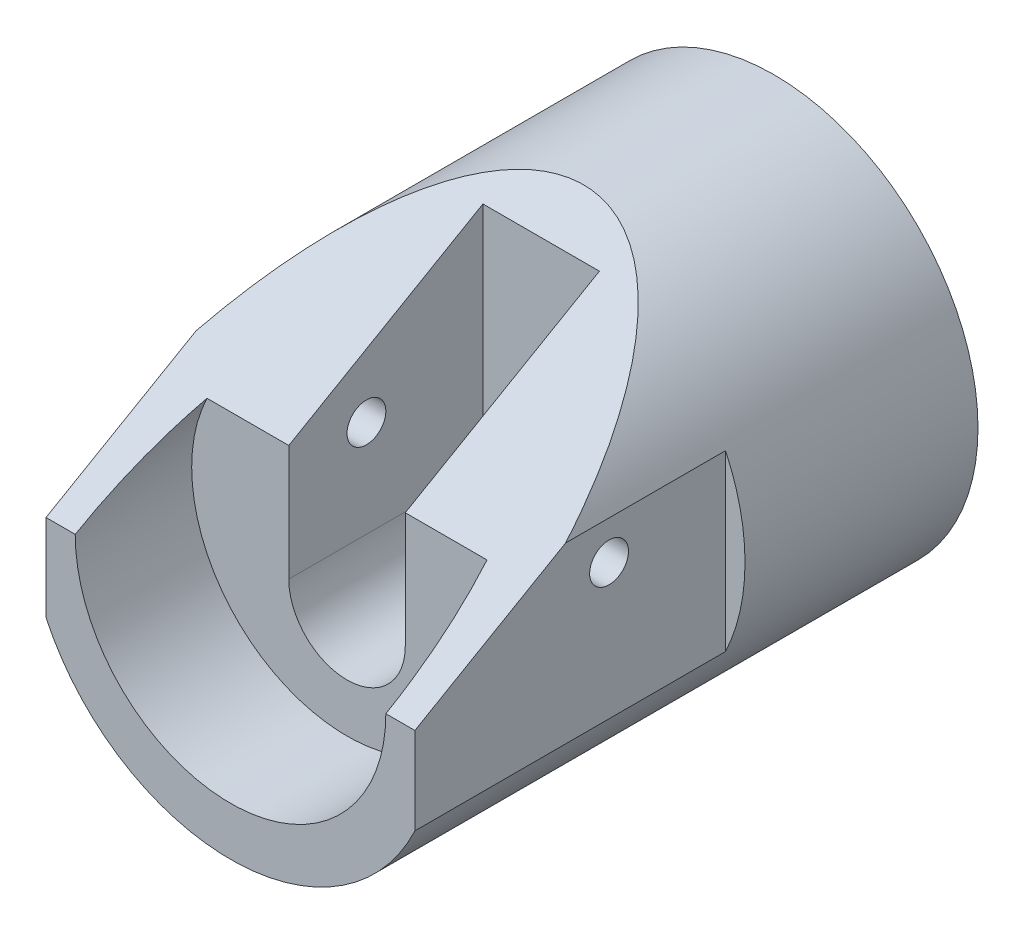
ISO-10303-21;
HEADER;
FILE_DESCRIPTION(('STEP AP214'),'2;1');
FILE_NAME('part.step','',(''),(''),'','','');
FILE_SCHEMA(('AUTOMOTIVE_DESIGN { 1 0 10303 214 1 1 1 1 }'));
ENDSEC;
DATA;
#1=APPLICATION_CONTEXT('core data for automotive mechanical design processes');
#2=APPLICATION_PROTOCOL_DEFINITION('international standard','automotive_design',2000,#1);
#3=PRODUCT_CONTEXT('',#1,'mechanical');
#4=PRODUCT('Part','Part','',(#3));
#5=PRODUCT_RELATED_PRODUCT_CATEGORY('part','',(#4));
#6=PRODUCT_DEFINITION_FORMATION('','',#4);
#7=PRODUCT_DEFINITION_CONTEXT('part definition',#1,'design');
#8=PRODUCT_DEFINITION('design','',#6,#7);
#9=PRODUCT_DEFINITION_SHAPE('','',#8);
#10=(LENGTH_UNIT() NAMED_UNIT(*) SI_UNIT(.MILLI.,.METRE.));
#11=(NAMED_UNIT(*) PLANE_ANGLE_UNIT() SI_UNIT($,.RADIAN.));
#12=(NAMED_UNIT(*) SI_UNIT($,.STERADIAN.) SOLID_ANGLE_UNIT());
#13=UNCERTAINTY_MEASURE_WITH_UNIT(LENGTH_MEASURE(1.E-05),#10,'distance_accuracy_value','');
#14=(GEOMETRIC_REPRESENTATION_CONTEXT(3) GLOBAL_UNCERTAINTY_ASSIGNED_CONTEXT((#13)) GLOBAL_UNIT_ASSIGNED_CONTEXT((#10,
#11,#12)) REPRESENTATION_CONTEXT('',''));
#15=CARTESIAN_POINT('',(0.,0.,0.));
#16=DIRECTION('',(0.,0.,1.));
#17=DIRECTION('',(1.,0.,0.));
#18=AXIS2_PLACEMENT_3D('',#15,#16,#17);
#19=CARTESIAN_POINT('',(0.,0.,88.9));
#20=DIRECTION('',(0.,0.,-1.));
#21=DIRECTION('',(-1.,0.,0.));
#22=AXIS2_PLACEMENT_3D('',#19,#20,#21);
#23=PLANE('',#22);
#24=DIRECTION('',(1.,0.,0.));
#25=VECTOR('',#24,1.);
#26=CARTESIAN_POINT('',(-33.3375,0.,88.9));
#27=LINE('',#26,#25);
#28=CARTESIAN_POINT('',(-30.1752,0.,88.9));
#29=VERTEX_POINT('',#28);
#30=CARTESIAN_POINT('',(-25.4,0.,88.9));
#31=VERTEX_POINT('',#30);
#32=EDGE_CURVE('E202',#29,#31,#27,.T.);
#33=ORIENTED_EDGE('',*,*,#32,.F.);
#34=DIRECTION('',(0.,1.,0.));
#35=VECTOR('',#34,1.);
#36=CARTESIAN_POINT('',(-30.1752,14.1720221284755,88.9));
#37=LINE('',#36,#35);
#38=CARTESIAN_POINT('',(-30.1752,-14.1720221284755,88.9));
#39=VERTEX_POINT('',#38);
#40=EDGE_CURVE('E135',#39,#29,#37,.T.);
#41=ORIENTED_EDGE('',*,*,#40,.F.);
#42=CARTESIAN_POINT('',(0.,0.,88.9));
#43=DIRECTION('',(0.,0.,1.));
#44=DIRECTION('',(1.,0.,0.));
#45=AXIS2_PLACEMENT_3D('',#42,#43,#44);
#46=CIRCLE('',#45,33.3375);
#47=CARTESIAN_POINT('',(30.1498,-14.2259785677471,88.9));
#48=VERTEX_POINT('',#47);
#49=EDGE_CURVE('E148',#39,#48,#46,.T.);
#50=ORIENTED_EDGE('',*,*,#49,.T.);
#51=DIRECTION('',(0.,-1.,0.));
#52=VECTOR('',#51,1.);
#53=CARTESIAN_POINT('',(30.1498,14.2259785677471,88.9));
#54=LINE('',#53,#52);
#55=CARTESIAN_POINT('',(30.1498,0.,88.9));
#56=VERTEX_POINT('',#55);
#57=EDGE_CURVE('E156',#56,#48,#54,.T.);
#58=ORIENTED_EDGE('',*,*,#57,.F.);
#59=CARTESIAN_POINT('',(25.4,0.,88.9));
#60=VERTEX_POINT('',#59);
#61=EDGE_CURVE('E200',#60,#56,#27,.T.);
#62=ORIENTED_EDGE('',*,*,#61,.F.);
#63=CARTESIAN_POINT('',(0.,0.,88.9));
#64=DIRECTION('',(0.,0.,1.));
#65=DIRECTION('',(1.,0.,0.));
#66=AXIS2_PLACEMENT_3D('',#63,#64,#65);
#67=CIRCLE('',#66,25.4);
#68=EDGE_CURVE('E197',#31,#60,#67,.T.);
#69=ORIENTED_EDGE('',*,*,#68,.F.);
#70=EDGE_LOOP('',(#33,#41,#50,#58,#62,#69));
#71=FACE_BOUND('',#70,.T.);
#72=ADVANCED_FACE('F49',(#71),#23,.F.);
#73=CARTESIAN_POINT('',(-33.3375,33.3375,31.1577562026717));
#74=DIRECTION('',(0.,-0.866025403784442,-0.499999999999995));
#75=DIRECTION('',(0.,0.499999999999995,-0.866025403784442));
#76=AXIS2_PLACEMENT_3D('',#73,#74,#75);
#77=PLANE('',#76);
#78=CARTESIAN_POINT('',(0.,0.,88.9));
#79=DIRECTION('',(0.,-0.866025403784442,-0.499999999999995));
#80=DIRECTION('',(0.,-0.499999999999995,0.866025403784442));
#81=AXIS2_PLACEMENT_3D('',#78,#79,#80);
#82=ELLIPSE('',#81,66.6750000000007,33.3375);
#83=CARTESIAN_POINT('',(-30.1752,14.1720221284755,64.3533376274897));
#84=VERTEX_POINT('',#83);
#85=CARTESIAN_POINT('',(30.1498,14.2259785677471,64.2598823332758));
#86=VERTEX_POINT('',#85);
#87=EDGE_CURVE('E14',#84,#86,#82,.T.);
#88=ORIENTED_EDGE('',*,*,#87,.F.);
#89=DIRECTION('',(0.,-0.499999999999995,0.866025403784442));
#90=VECTOR('',#89,1.);
#91=CARTESIAN_POINT('',(-30.1752,33.3375,31.1577562026717));
#92=LINE('',#91,#90);
#93=EDGE_CURVE('E166',#84,#29,#92,.T.);
#94=ORIENTED_EDGE('',*,*,#93,.T.);
#95=ORIENTED_EDGE('',*,*,#32,.T.);
#96=CARTESIAN_POINT('',(0.,0.,88.9));
#97=DIRECTION('',(0.,-0.866025403784442,-0.499999999999995));
#98=DIRECTION('',(0.,-0.499999999999995,0.866025403784442));
#99=AXIS2_PLACEMENT_3D('',#96,#97,#98);
#100=ELLIPSE('',#99,50.8000000000005,25.4);
#101=CARTESIAN_POINT('',(-22.8952505991964,10.9985226280622,69.85));
#102=VERTEX_POINT('',#101);
#103=EDGE_CURVE('E211',#31,#102,#100,.T.);
#104=ORIENTED_EDGE('',*,*,#103,.T.);
#105=DIRECTION('',(-1.,0.,0.));
#106=VECTOR('',#105,1.);
#107=CARTESIAN_POINT('',(-33.3375,10.9985226280622,69.85));
#108=LINE('',#107,#106);
#109=CARTESIAN_POINT('',(-9.525,10.9985226280622,69.85));
#110=VERTEX_POINT('',#109);
#111=EDGE_CURVE('E204',#110,#102,#108,.T.);
#112=ORIENTED_EDGE('',*,*,#111,.F.);
#113=DIRECTION('',(0.,0.499999999999995,-0.866025403784442));
#114=VECTOR('',#113,1.);
#115=CARTESIAN_POINT('',(-9.525,33.3375,31.1577562026717));
#116=LINE('',#115,#114);
#117=CARTESIAN_POINT('',(-9.525,29.3293936748326,38.1));
#118=VERTEX_POINT('',#117);
#119=EDGE_CURVE('E194',#110,#118,#116,.T.);
#120=ORIENTED_EDGE('',*,*,#119,.T.);
#121=DIRECTION('',(-1.,0.,0.));
#122=VECTOR('',#121,1.);
#123=CARTESIAN_POINT('',(-33.3375,29.3293936748326,38.1));
#124=LINE('',#123,#122);
#125=CARTESIAN_POINT('',(9.525,29.3293936748326,38.1));
#126=VERTEX_POINT('',#125);
#127=EDGE_CURVE('E57',#126,#118,#124,.T.);
#128=ORIENTED_EDGE('',*,*,#127,.F.);
#129=DIRECTION('',(0.,-0.499999999999995,0.866025403784442));
#130=VECTOR('',#129,1.);
#131=CARTESIAN_POINT('',(9.525,33.3375,31.1577562026717));
#132=LINE('',#131,#130);
#133=CARTESIAN_POINT('',(9.525,10.9985226280622,69.85));
#134=VERTEX_POINT('',#133);
#135=EDGE_CURVE('E189',#126,#134,#132,.T.);
#136=ORIENTED_EDGE('',*,*,#135,.T.);
#137=CARTESIAN_POINT('',(22.8952505991964,10.9985226280622,69.85));
#138=VERTEX_POINT('',#137);
#139=EDGE_CURVE('E205',#138,#134,#108,.T.);
#140=ORIENTED_EDGE('',*,*,#139,.F.);
#141=EDGE_CURVE('E208',#138,#60,#100,.T.);
#142=ORIENTED_EDGE('',*,*,#141,.T.);
#143=ORIENTED_EDGE('',*,*,#61,.T.);
#144=DIRECTION('',(0.,0.499999999999995,-0.866025403784442));
#145=VECTOR('',#144,1.);
#146=CARTESIAN_POINT('',(30.1498,33.3375,31.1577562026717));
#147=LINE('',#146,#145);
#148=EDGE_CURVE('E150',#56,#86,#147,.T.);
#149=ORIENTED_EDGE('',*,*,#148,.T.);
#150=EDGE_LOOP('',(#88,#94,#95,#104,#112,#120,#128,#136,#140,#142,#143,#149));
#151=FACE_BOUND('',#150,.T.);
#152=ADVANCED_FACE('F226',(#151),#77,.F.);
#153=CARTESIAN_POINT('',(0.,0.,69.85));
#154=DIRECTION('',(0.,0.,1.));
#155=DIRECTION('',(1.,0.,0.));
#156=AXIS2_PLACEMENT_3D('',#153,#154,#155);
#157=CYLINDRICAL_SURFACE('',#156,25.4);
#158=ORIENTED_EDGE('',*,*,#68,.T.);
#159=ORIENTED_EDGE('',*,*,#141,.F.);
#160=CARTESIAN_POINT('',(0.,0.,69.85));
#161=DIRECTION('',(0.,0.,1.));
#162=DIRECTION('',(1.,0.,0.));
#163=AXIS2_PLACEMENT_3D('',#160,#161,#162);
#164=CIRCLE('',#163,25.4);
#165=EDGE_CURVE('E198',#102,#138,#164,.T.);
#166=ORIENTED_EDGE('',*,*,#165,.F.);
#167=ORIENTED_EDGE('',*,*,#103,.F.);
#168=EDGE_LOOP('',(#158,#159,#166,#167));
#169=FACE_BOUND('',#168,.T.);
#170=ADVANCED_FACE('F235',(#169),#157,.F.);
#171=CARTESIAN_POINT('',(0.,0.,69.85));
#172=DIRECTION('',(0.,0.,1.));
#173=DIRECTION('',(1.,0.,0.));
#174=AXIS2_PLACEMENT_3D('',#171,#172,#173);
#175=PLANE('',#174);
#176=DIRECTION('',(0.,-1.,0.));
#177=VECTOR('',#176,1.);
#178=CARTESIAN_POINT('',(-9.525,0.,69.85));
#179=LINE('',#178,#177);
#180=CARTESIAN_POINT('',(-9.525,-7.9248,69.85));
#181=VERTEX_POINT('',#180);
#182=EDGE_CURVE('E212',#110,#181,#179,.T.);
#183=ORIENTED_EDGE('',*,*,#182,.F.);
#184=ORIENTED_EDGE('',*,*,#111,.T.);
#185=ORIENTED_EDGE('',*,*,#165,.T.);
#186=ORIENTED_EDGE('',*,*,#139,.T.);
#187=DIRECTION('',(0.,1.,0.));
#188=VECTOR('',#187,1.);
#189=CARTESIAN_POINT('',(9.525,33.3375,69.85));
#190=LINE('',#189,#188);
#191=CARTESIAN_POINT('',(9.525,-7.9248,69.85));
#192=VERTEX_POINT('',#191);
#193=EDGE_CURVE('E178',#192,#134,#190,.T.);
#194=ORIENTED_EDGE('',*,*,#193,.F.);
#195=CARTESIAN_POINT('',(0.,-7.9248,69.85));
#196=DIRECTION('',(0.,0.,1.));
#197=DIRECTION('',(1.,0.,0.));
#198=AXIS2_PLACEMENT_3D('',#195,#196,#197);
#199=CIRCLE('',#198,9.525);
#200=EDGE_CURVE('E172',#181,#192,#199,.T.);
#201=ORIENTED_EDGE('',*,*,#200,.F.);
#202=EDGE_LOOP('',(#183,#184,#185,#186,#194,#201));
#203=FACE_BOUND('',#202,.T.);
#204=ADVANCED_FACE('F231',(#203),#175,.T.);
#205=CARTESIAN_POINT('',(0.,-7.9248,38.1));
#206=DIRECTION('',(0.,0.,1.));
#207=DIRECTION('',(1.,0.,0.));
#208=AXIS2_PLACEMENT_3D('',#205,#206,#207);
#209=PLANE('',#208);
#210=ORIENTED_EDGE('',*,*,#127,.T.);
#211=DIRECTION('',(0.,-1.,0.));
#212=VECTOR('',#211,1.);
#213=CARTESIAN_POINT('',(-9.525,-7.9248,38.1));
#214=LINE('',#213,#212);
#215=CARTESIAN_POINT('',(-9.525,-7.9248,38.1));
#216=VERTEX_POINT('',#215);
#217=EDGE_CURVE('E181',#118,#216,#214,.T.);
#218=ORIENTED_EDGE('',*,*,#217,.T.);
#219=CARTESIAN_POINT('',(0.,-7.9248,38.1));
#220=DIRECTION('',(0.,0.,1.));
#221=DIRECTION('',(1.,0.,0.));
#222=AXIS2_PLACEMENT_3D('',#219,#220,#221);
#223=CIRCLE('',#222,9.525);
#224=CARTESIAN_POINT('',(9.525,-7.9248,38.1));
#225=VERTEX_POINT('',#224);
#226=EDGE_CURVE('E174',#216,#225,#223,.T.);
#227=ORIENTED_EDGE('',*,*,#226,.T.);
#228=DIRECTION('',(0.,1.,0.));
#229=VECTOR('',#228,1.);
#230=CARTESIAN_POINT('',(9.525,33.3375,38.1));
#231=LINE('',#230,#229);
#232=EDGE_CURVE('E177',#225,#126,#231,.T.);
#233=ORIENTED_EDGE('',*,*,#232,.T.);
#234=EDGE_LOOP('',(#210,#218,#227,#233));
#235=FACE_BOUND('',#234,.T.);
#236=ADVANCED_FACE('F216',(#235),#209,.T.);
#237=CARTESIAN_POINT('',(-9.525,-7.9248,38.1));
#238=DIRECTION('',(-1.,0.,0.));
#239=DIRECTION('',(0.,-1.,0.));
#240=AXIS2_PLACEMENT_3D('',#237,#238,#239);
#241=PLANE('',#240);
#242=CARTESIAN_POINT('',(-9.525,7.92479999999999,57.15));
#243=DIRECTION('',(-1.,0.,0.));
#244=DIRECTION('',(0.,-1.,0.));
#245=AXIS2_PLACEMENT_3D('',#242,#243,#244);
#246=CIRCLE('',#245,3.175);
#247=CARTESIAN_POINT('',(-9.525,7.92479999999999,53.975));
#248=VERTEX_POINT('',#247);
#249=EDGE_CURVE('E160',#248,#248,#246,.T.);
#250=ORIENTED_EDGE('',*,*,#249,.T.);
#251=EDGE_LOOP('',(#250));
#252=FACE_BOUND('',#251,.T.);
#253=ORIENTED_EDGE('',*,*,#182,.T.);
#254=DIRECTION('',(0.,0.,1.));
#255=VECTOR('',#254,1.);
#256=CARTESIAN_POINT('',(-9.525,-7.9248,38.1));
#257=LINE('',#256,#255);
#258=EDGE_CURVE('E186',#216,#181,#257,.T.);
#259=ORIENTED_EDGE('',*,*,#258,.F.);
#260=ORIENTED_EDGE('',*,*,#217,.F.);
#261=ORIENTED_EDGE('',*,*,#119,.F.);
#262=EDGE_LOOP('',(#253,#259,#260,#261));
#263=FACE_BOUND('',#262,.T.);
#264=ADVANCED_FACE('F221',(#252,#263),#241,.F.);
#265=CARTESIAN_POINT('',(9.525,33.3375,38.1));
#266=DIRECTION('',(1.,0.,0.));
#267=DIRECTION('',(0.,1.,0.));
#268=AXIS2_PLACEMENT_3D('',#265,#266,#267);
#269=PLANE('',#268);
#270=CARTESIAN_POINT('',(9.525,7.92479999999999,57.15));
#271=DIRECTION('',(1.,0.,0.));
#272=DIRECTION('',(0.,1.,0.));
#273=AXIS2_PLACEMENT_3D('',#270,#271,#272);
#274=CIRCLE('',#273,3.175);
#275=CARTESIAN_POINT('',(9.525,7.92479999999999,53.975));
#276=VERTEX_POINT('',#275);
#277=EDGE_CURVE('E301',#276,#276,#274,.T.);
#278=ORIENTED_EDGE('',*,*,#277,.T.);
#279=EDGE_LOOP('',(#278));
#280=FACE_BOUND('',#279,.T.);
#281=ORIENTED_EDGE('',*,*,#232,.F.);
#282=DIRECTION('',(0.,0.,1.));
#283=VECTOR('',#282,1.);
#284=CARTESIAN_POINT('',(9.525,-7.9248,38.1));
#285=LINE('',#284,#283);
#286=EDGE_CURVE('E183',#225,#192,#285,.T.);
#287=ORIENTED_EDGE('',*,*,#286,.T.);
#288=ORIENTED_EDGE('',*,*,#193,.T.);
#289=ORIENTED_EDGE('',*,*,#135,.F.);
#290=EDGE_LOOP('',(#281,#287,#288,#289));
#291=FACE_BOUND('',#290,.T.);
#292=ADVANCED_FACE('F242',(#280,#291),#269,.F.);
#293=CARTESIAN_POINT('',(0.,-7.9248,38.1));
#294=DIRECTION('',(0.,0.,1.));
#295=DIRECTION('',(1.,0.,0.));
#296=AXIS2_PLACEMENT_3D('',#293,#294,#295);
#297=CYLINDRICAL_SURFACE('',#296,9.525);
#298=ORIENTED_EDGE('',*,*,#200,.T.);
#299=ORIENTED_EDGE('',*,*,#286,.F.);
#300=ORIENTED_EDGE('',*,*,#226,.F.);
#301=ORIENTED_EDGE('',*,*,#258,.T.);
#302=EDGE_LOOP('',(#298,#299,#300,#301));
#303=FACE_BOUND('',#302,.T.);
#304=ADVANCED_FACE('F244',(#303),#297,.F.);
#305=CARTESIAN_POINT('',(0.,0.,0.));
#306=DIRECTION('',(0.,0.,1.));
#307=DIRECTION('',(1.,0.,0.));
#308=AXIS2_PLACEMENT_3D('',#305,#306,#307);
#309=CYLINDRICAL_SURFACE('',#308,33.3375);
#310=DIRECTION('',(0.,0.,1.));
#311=VECTOR('',#310,1.);
#312=CARTESIAN_POINT('',(-30.1752,14.1720221284755,38.1));
#313=LINE('',#312,#311);
#314=CARTESIAN_POINT('',(-30.1752,14.1720221284755,38.1));
#315=VERTEX_POINT('',#314);
#316=EDGE_CURVE('E141',#315,#84,#313,.T.);
#317=ORIENTED_EDGE('',*,*,#316,.T.);
#318=ORIENTED_EDGE('',*,*,#87,.T.);
#319=DIRECTION('',(0.,0.,1.));
#320=VECTOR('',#319,1.);
#321=CARTESIAN_POINT('',(30.1498,14.2259785677471,38.1));
#322=LINE('',#321,#320);
#323=CARTESIAN_POINT('',(30.1498,14.2259785677471,38.1));
#324=VERTEX_POINT('',#323);
#325=EDGE_CURVE('E158',#324,#86,#322,.T.);
#326=ORIENTED_EDGE('',*,*,#325,.F.);
#327=CARTESIAN_POINT('',(0.,0.,38.1));
#328=DIRECTION('',(0.,0.,1.));
#329=DIRECTION('',(1.,0.,0.));
#330=AXIS2_PLACEMENT_3D('',#327,#328,#329);
#331=CIRCLE('',#330,33.3375);
#332=CARTESIAN_POINT('',(30.1498,-14.2259785677471,38.1));
#333=VERTEX_POINT('',#332);
#334=EDGE_CURVE('E154',#333,#324,#331,.T.);
#335=ORIENTED_EDGE('',*,*,#334,.F.);
#336=DIRECTION('',(0.,0.,1.));
#337=VECTOR('',#336,1.);
#338=CARTESIAN_POINT('',(30.1498,-14.2259785677471,38.1));
#339=LINE('',#338,#337);
#340=EDGE_CURVE('E161',#333,#48,#339,.T.);
#341=ORIENTED_EDGE('',*,*,#340,.T.);
#342=ORIENTED_EDGE('',*,*,#49,.F.);
#343=DIRECTION('',(0.,0.,1.));
#344=VECTOR('',#343,1.);
#345=CARTESIAN_POINT('',(-30.1752,-14.1720221284755,38.1));
#346=LINE('',#345,#344);
#347=CARTESIAN_POINT('',(-30.1752,-14.1720221284755,38.1));
#348=VERTEX_POINT('',#347);
#349=EDGE_CURVE('E139',#348,#39,#346,.T.);
#350=ORIENTED_EDGE('',*,*,#349,.F.);
#351=CARTESIAN_POINT('',(0.,0.,38.1));
#352=DIRECTION('',(0.,0.,1.));
#353=DIRECTION('',(1.,0.,0.));
#354=AXIS2_PLACEMENT_3D('',#351,#352,#353);
#355=CIRCLE('',#354,33.3375);
#356=EDGE_CURVE('E130',#315,#348,#355,.T.);
#357=ORIENTED_EDGE('',*,*,#356,.F.);
#358=EDGE_LOOP('',(#317,#318,#326,#335,#341,#342,#350,#357));
#359=FACE_BOUND('',#358,.T.);
#360=CARTESIAN_POINT('',(0.,0.,0.));
#361=DIRECTION('',(0.,0.,1.));
#362=DIRECTION('',(1.,0.,0.));
#363=AXIS2_PLACEMENT_3D('',#360,#361,#362);
#364=CIRCLE('',#363,33.3375);
#365=CARTESIAN_POINT('',(33.3375,0.,0.));
#366=VERTEX_POINT('',#365);
#367=EDGE_CURVE('E169',#366,#366,#364,.T.);
#368=ORIENTED_EDGE('',*,*,#367,.T.);
#369=EDGE_LOOP('',(#368));
#370=FACE_BOUND('',#369,.T.);
#371=ADVANCED_FACE('F144',(#359,#370),#309,.T.);
#372=CARTESIAN_POINT('',(0.,0.,0.));
#373=DIRECTION('',(0.,0.,-1.));
#374=DIRECTION('',(-1.,0.,0.));
#375=AXIS2_PLACEMENT_3D('',#372,#373,#374);
#376=PLANE('',#375);
#377=ORIENTED_EDGE('',*,*,#367,.F.);
#378=EDGE_LOOP('',(#377));
#379=FACE_BOUND('',#378,.T.);
#380=ADVANCED_FACE('F51',(#379),#376,.T.);
#381=CARTESIAN_POINT('',(30.1498,14.2259785677471,38.1));
#382=DIRECTION('',(-1.,0.,0.));
#383=DIRECTION('',(0.,0.,1.));
#384=AXIS2_PLACEMENT_3D('',#381,#382,#383);
#385=PLANE('',#384);
#386=CARTESIAN_POINT('',(30.1498,7.92479999999999,57.15));
#387=DIRECTION('',(1.,0.,0.));
#388=DIRECTION('',(0.,0.,-1.));
#389=AXIS2_PLACEMENT_3D('',#386,#387,#388);
#390=CIRCLE('',#389,3.175);
#391=CARTESIAN_POINT('',(30.1498,7.92479999999999,53.975));
#392=VERTEX_POINT('',#391);
#393=EDGE_CURVE('E310',#392,#392,#390,.T.);
#394=ORIENTED_EDGE('',*,*,#393,.F.);
#395=EDGE_LOOP('',(#394));
#396=FACE_BOUND('',#395,.T.);
#397=ORIENTED_EDGE('',*,*,#57,.T.);
#398=ORIENTED_EDGE('',*,*,#340,.F.);
#399=DIRECTION('',(0.,-1.,0.));
#400=VECTOR('',#399,1.);
#401=CARTESIAN_POINT('',(30.1498,14.2259785677471,38.1));
#402=LINE('',#401,#400);
#403=EDGE_CURVE('E70',#324,#333,#402,.T.);
#404=ORIENTED_EDGE('',*,*,#403,.F.);
#405=ORIENTED_EDGE('',*,*,#325,.T.);
#406=ORIENTED_EDGE('',*,*,#148,.F.);
#407=EDGE_LOOP('',(#397,#398,#404,#405,#406));
#408=FACE_BOUND('',#407,.T.);
#409=ADVANCED_FACE('F275',(#396,#408),#385,.F.);
#410=CARTESIAN_POINT('',(0.,0.,38.1));
#411=DIRECTION('',(0.,0.,1.));
#412=DIRECTION('',(1.,0.,0.));
#413=AXIS2_PLACEMENT_3D('',#410,#411,#412);
#414=PLANE('',#413);
#415=ORIENTED_EDGE('',*,*,#334,.T.);
#416=ORIENTED_EDGE('',*,*,#403,.T.);
#417=EDGE_LOOP('',(#415,#416));
#418=FACE_BOUND('',#417,.T.);
#419=ADVANCED_FACE('F278',(#418),#414,.T.);
#420=CARTESIAN_POINT('',(-30.1752,14.1720221284755,38.1));
#421=DIRECTION('',(1.,0.,0.));
#422=DIRECTION('',(0.,0.,-1.));
#423=AXIS2_PLACEMENT_3D('',#420,#421,#422);
#424=PLANE('',#423);
#425=CARTESIAN_POINT('',(-30.1752,7.92479999999999,57.15));
#426=DIRECTION('',(1.,0.,0.));
#427=DIRECTION('',(0.,0.,-1.));
#428=AXIS2_PLACEMENT_3D('',#425,#426,#427);
#429=CIRCLE('',#428,3.175);
#430=CARTESIAN_POINT('',(-30.1752,7.92479999999999,53.975));
#431=VERTEX_POINT('',#430);
#432=EDGE_CURVE('E298',#431,#431,#429,.T.);
#433=ORIENTED_EDGE('',*,*,#432,.T.);
#434=EDGE_LOOP('',(#433));
#435=FACE_BOUND('',#434,.T.);
#436=ORIENTED_EDGE('',*,*,#316,.F.);
#437=DIRECTION('',(0.,1.,0.));
#438=VECTOR('',#437,1.);
#439=CARTESIAN_POINT('',(-30.1752,14.1720221284755,38.1));
#440=LINE('',#439,#438);
#441=EDGE_CURVE('E63',#348,#315,#440,.T.);
#442=ORIENTED_EDGE('',*,*,#441,.F.);
#443=ORIENTED_EDGE('',*,*,#349,.T.);
#444=ORIENTED_EDGE('',*,*,#40,.T.);
#445=ORIENTED_EDGE('',*,*,#93,.F.);
#446=EDGE_LOOP('',(#436,#442,#443,#444,#445));
#447=FACE_BOUND('',#446,.T.);
#448=ADVANCED_FACE('F138',(#435,#447),#424,.F.);
#449=CARTESIAN_POINT('',(0.,0.,38.1));
#450=DIRECTION('',(0.,0.,1.));
#451=DIRECTION('',(1.,0.,0.));
#452=AXIS2_PLACEMENT_3D('',#449,#450,#451);
#453=PLANE('',#452);
#454=ORIENTED_EDGE('',*,*,#356,.T.);
#455=ORIENTED_EDGE('',*,*,#441,.T.);
#456=EDGE_LOOP('',(#454,#455));
#457=FACE_BOUND('',#456,.T.);
#458=ADVANCED_FACE('F131',(#457),#453,.T.);
#459=CARTESIAN_POINT('',(-30.1752,7.92479999999999,57.15));
#460=DIRECTION('',(1.,0.,0.));
#461=DIRECTION('',(0.,0.,-1.));
#462=AXIS2_PLACEMENT_3D('',#459,#460,#461);
#463=CYLINDRICAL_SURFACE('',#462,3.175);
#464=CARTESIAN_POINT('',(-30.1752,7.92479999999999,53.975));
#465=CARTESIAN_POINT('',(-29.96009375,7.92479999999999,53.975));
#466=CARTESIAN_POINT('',(-29.7449875,7.92479999999999,53.975));
#467=CARTESIAN_POINT('',(-29.314775,7.92479999999999,53.975));
#468=CARTESIAN_POINT('',(-29.09966875,7.92479999999999,53.975));
#469=CARTESIAN_POINT('',(-28.66945625,7.92479999999999,53.975));
#470=CARTESIAN_POINT('',(-28.45435,7.92479999999999,53.975));
#471=CARTESIAN_POINT('',(-28.0241375,7.92479999999999,53.975));
#472=CARTESIAN_POINT('',(-27.80903125,7.92479999999999,53.975));
#473=CARTESIAN_POINT('',(-27.37881875,7.92479999999999,53.975));
#474=CARTESIAN_POINT('',(-27.1637125,7.92479999999999,53.975));
#475=CARTESIAN_POINT('',(-26.7335,7.92479999999999,53.975));
#476=CARTESIAN_POINT('',(-26.51839375,7.92479999999999,53.975));
#477=CARTESIAN_POINT('',(-26.08818125,7.92479999999999,53.975));
#478=CARTESIAN_POINT('',(-25.873075,7.92479999999999,53.975));
#479=CARTESIAN_POINT('',(-25.4428625,7.92479999999999,53.975));
#480=CARTESIAN_POINT('',(-25.22775625,7.92479999999999,53.975));
#481=CARTESIAN_POINT('',(-24.79754375,7.92479999999999,53.975));
#482=CARTESIAN_POINT('',(-24.5824375,7.92479999999999,53.975));
#483=CARTESIAN_POINT('',(-24.152225,7.92479999999999,53.975));
#484=CARTESIAN_POINT('',(-23.93711875,7.92479999999999,53.975));
#485=CARTESIAN_POINT('',(-23.50690625,7.92479999999999,53.975));
#486=CARTESIAN_POINT('',(-23.2918,7.92479999999999,53.975));
#487=CARTESIAN_POINT('',(-22.8615875,7.92479999999999,53.975));
#488=CARTESIAN_POINT('',(-22.64648125,7.92479999999999,53.975));
#489=CARTESIAN_POINT('',(-22.21626875,7.92479999999999,53.975));
#490=CARTESIAN_POINT('',(-22.0011625,7.92479999999999,53.975));
#491=CARTESIAN_POINT('',(-21.57095,7.92479999999999,53.975));
#492=CARTESIAN_POINT('',(-21.35584375,7.92479999999999,53.975));
#493=CARTESIAN_POINT('',(-20.92563125,7.92479999999999,53.975));
#494=CARTESIAN_POINT('',(-20.710525,7.92479999999999,53.975));
#495=CARTESIAN_POINT('',(-20.2803125,7.92479999999999,53.975));
#496=CARTESIAN_POINT('',(-20.06520625,7.92479999999999,53.975));
#497=CARTESIAN_POINT('',(-19.63499375,7.92479999999999,53.975));
#498=CARTESIAN_POINT('',(-19.4198875,7.92479999999999,53.975));
#499=CARTESIAN_POINT('',(-18.989675,7.92479999999999,53.975));
#500=CARTESIAN_POINT('',(-18.77456875,7.92479999999999,53.975));
#501=CARTESIAN_POINT('',(-18.34435625,7.92479999999999,53.975));
#502=CARTESIAN_POINT('',(-18.12925,7.92479999999999,53.975));
#503=CARTESIAN_POINT('',(-17.6990375,7.92479999999999,53.975));
#504=CARTESIAN_POINT('',(-17.48393125,7.92479999999999,53.975));
#505=CARTESIAN_POINT('',(-17.05371875,7.92479999999999,53.975));
#506=CARTESIAN_POINT('',(-16.8386125,7.92479999999999,53.975));
#507=CARTESIAN_POINT('',(-16.4084,7.92479999999999,53.975));
#508=CARTESIAN_POINT('',(-16.19329375,7.92479999999999,53.975));
#509=CARTESIAN_POINT('',(-15.76308125,7.92479999999999,53.975));
#510=CARTESIAN_POINT('',(-15.547975,7.92479999999999,53.975));
#511=CARTESIAN_POINT('',(-15.1177625,7.92479999999999,53.975));
#512=CARTESIAN_POINT('',(-14.90265625,7.92479999999999,53.975));
#513=CARTESIAN_POINT('',(-14.47244375,7.92479999999999,53.975));
#514=CARTESIAN_POINT('',(-14.2573375,7.92479999999999,53.975));
#515=CARTESIAN_POINT('',(-13.827125,7.92479999999999,53.975));
#516=CARTESIAN_POINT('',(-13.61201875,7.92479999999999,53.975));
#517=CARTESIAN_POINT('',(-13.18180625,7.92479999999999,53.975));
#518=CARTESIAN_POINT('',(-12.9667,7.92479999999999,53.975));
#519=CARTESIAN_POINT('',(-12.5364875,7.92479999999999,53.975));
#520=CARTESIAN_POINT('',(-12.32138125,7.92479999999999,53.975));
#521=CARTESIAN_POINT('',(-11.89116875,7.92479999999999,53.975));
#522=CARTESIAN_POINT('',(-11.6760625,7.92479999999999,53.975));
#523=CARTESIAN_POINT('',(-11.24585,7.92479999999999,53.975));
#524=CARTESIAN_POINT('',(-11.03074375,7.92479999999999,53.975));
#525=CARTESIAN_POINT('',(-10.60053125,7.92479999999999,53.975));
#526=CARTESIAN_POINT('',(-10.385425,7.92479999999999,53.975));
#527=CARTESIAN_POINT('',(-9.95521249999999,7.92479999999999,53.975));
#528=CARTESIAN_POINT('',(-9.74010624999999,7.92479999999999,53.975));
#529=CARTESIAN_POINT('',(-9.525,7.92479999999999,53.975));
#530=B_SPLINE_CURVE_WITH_KNOTS('',3,(#464,#465,#466,#467,#468,#469,#470,#471,#472,#473,#474,
#475,#476,#477,#478,#479,#480,#481,#482,#483,#484,#485,#486,#487,#488,#489,#490,#491,#492,#493,
#494,#495,#496,#497,#498,#499,#500,#501,#502,#503,#504,#505,#506,#507,#508,#509,#510,#511,#512,
#513,#514,#515,#516,#517,#518,#519,#520,#521,#522,#523,#524,#525,#526,#527,#528,#529),
.UNSPECIFIED.,.F.,.F.,(4,2,2,2,2,2,2,2,2,2,2,2,2,2,2,2,2,2,2,2,2,2,2,2,2,2,2,2,2,2,2,2,4),(0.,
0.645318749999998,1.2906375,1.93595625,2.581275,3.22659375,3.8719125,4.51723125,5.16255,
5.80786875,6.4531875,7.09850625,7.743825,8.38914375,9.0344625,9.67978125,10.3251,10.97041875,
11.6157375,12.26105625,12.906375,13.55169375,14.1970125,14.84233125,15.48765,16.13296875,
16.7782875,17.42360625,18.068925,18.71424375,19.3595625,20.00488125,20.6502),.UNSPECIFIED.);
#531=EDGE_CURVE('BSEAM287',#431,#248,#530,.T.);
#532=ORIENTED_EDGE('',*,*,#432,.F.);
#533=ORIENTED_EDGE('',*,*,#249,.F.);
#534=ORIENTED_EDGE('',*,*,#531,.T.);
#535=ORIENTED_EDGE('',*,*,#531,.F.);
#536=EDGE_LOOP('',(#532,#534,#533,#535));
#537=FACE_BOUND('',#536,.T.);
#538=ADVANCED_FACE('F287',(#537),#463,.F.);
#539=CARTESIAN_POINT('',(30.1498,7.92479999999999,53.975));
#540=CARTESIAN_POINT('',(29.9349583333333,7.92479999999999,53.975));
#541=CARTESIAN_POINT('',(29.7201166666667,7.92479999999999,53.975));
#542=CARTESIAN_POINT('',(29.2904333333333,7.92479999999999,53.975));
#543=CARTESIAN_POINT('',(29.0755916666667,7.92479999999999,53.975));
#544=CARTESIAN_POINT('',(28.6459083333333,7.92479999999999,53.975));
#545=CARTESIAN_POINT('',(28.4310666666667,7.92479999999999,53.975));
#546=CARTESIAN_POINT('',(28.0013833333333,7.92479999999999,53.975));
#547=CARTESIAN_POINT('',(27.7865416666667,7.92479999999999,53.975));
#548=CARTESIAN_POINT('',(27.3568583333333,7.92479999999999,53.975));
#549=CARTESIAN_POINT('',(27.1420166666667,7.92479999999999,53.975));
#550=CARTESIAN_POINT('',(26.7123333333333,7.92479999999999,53.975));
#551=CARTESIAN_POINT('',(26.4974916666667,7.92479999999999,53.975));
#552=CARTESIAN_POINT('',(26.0678083333333,7.92479999999999,53.975));
#553=CARTESIAN_POINT('',(25.8529666666667,7.92479999999999,53.975));
#554=CARTESIAN_POINT('',(25.4232833333333,7.92479999999999,53.975));
#555=CARTESIAN_POINT('',(25.2084416666667,7.92479999999999,53.975));
#556=CARTESIAN_POINT('',(24.7787583333333,7.92479999999999,53.975));
#557=CARTESIAN_POINT('',(24.5639166666667,7.92479999999999,53.975));
#558=CARTESIAN_POINT('',(24.1342333333333,7.92479999999999,53.975));
#559=CARTESIAN_POINT('',(23.9193916666667,7.92479999999999,53.975));
#560=CARTESIAN_POINT('',(23.4897083333333,7.92479999999999,53.975));
#561=CARTESIAN_POINT('',(23.2748666666667,7.92479999999999,53.975));
#562=CARTESIAN_POINT('',(22.8451833333333,7.92479999999999,53.975));
#563=CARTESIAN_POINT('',(22.6303416666667,7.92479999999999,53.975));
#564=CARTESIAN_POINT('',(22.2006583333333,7.92479999999999,53.975));
#565=CARTESIAN_POINT('',(21.9858166666667,7.92479999999999,53.975));
#566=CARTESIAN_POINT('',(21.5561333333333,7.92479999999999,53.975));
#567=CARTESIAN_POINT('',(21.3412916666667,7.92479999999999,53.975));
#568=CARTESIAN_POINT('',(20.9116083333333,7.92479999999999,53.975));
#569=CARTESIAN_POINT('',(20.6967666666667,7.92479999999999,53.975));
#570=CARTESIAN_POINT('',(20.2670833333333,7.92479999999999,53.975));
#571=CARTESIAN_POINT('',(20.0522416666667,7.92479999999999,53.975));
#572=CARTESIAN_POINT('',(19.6225583333333,7.92479999999999,53.975));
#573=CARTESIAN_POINT('',(19.4077166666667,7.92479999999999,53.975));
#574=CARTESIAN_POINT('',(18.9780333333333,7.92479999999999,53.975));
#575=CARTESIAN_POINT('',(18.7631916666667,7.92479999999999,53.975));
#576=CARTESIAN_POINT('',(18.3335083333333,7.92479999999999,53.975));
#577=CARTESIAN_POINT('',(18.1186666666667,7.92479999999999,53.975));
#578=CARTESIAN_POINT('',(17.6889833333333,7.92479999999999,53.975));
#579=CARTESIAN_POINT('',(17.4741416666667,7.92479999999999,53.975));
#580=CARTESIAN_POINT('',(17.0444583333333,7.92479999999999,53.975));
#581=CARTESIAN_POINT('',(16.8296166666667,7.92479999999999,53.975));
#582=CARTESIAN_POINT('',(16.3999333333333,7.92479999999999,53.975));
#583=CARTESIAN_POINT('',(16.1850916666667,7.92479999999999,53.975));
#584=CARTESIAN_POINT('',(15.7554083333333,7.92479999999999,53.975));
#585=CARTESIAN_POINT('',(15.5405666666667,7.92479999999999,53.975));
#586=CARTESIAN_POINT('',(15.1108833333333,7.92479999999999,53.975));
#587=CARTESIAN_POINT('',(14.8960416666667,7.92479999999999,53.975));
#588=CARTESIAN_POINT('',(14.4663583333333,7.92479999999999,53.975));
#589=CARTESIAN_POINT('',(14.2515166666667,7.92479999999999,53.975));
#590=CARTESIAN_POINT('',(13.8218333333333,7.92479999999999,53.975));
#591=CARTESIAN_POINT('',(13.6069916666667,7.92479999999999,53.975));
#592=CARTESIAN_POINT('',(13.1773083333333,7.92479999999999,53.975));
#593=CARTESIAN_POINT('',(12.9624666666667,7.92479999999999,53.975));
#594=CARTESIAN_POINT('',(12.5327833333333,7.92479999999999,53.975));
#595=CARTESIAN_POINT('',(12.3179416666667,7.92479999999999,53.975));
#596=CARTESIAN_POINT('',(11.8882583333333,7.92479999999999,53.975));
#597=CARTESIAN_POINT('',(11.6734166666667,7.92479999999999,53.975));
#598=CARTESIAN_POINT('',(11.2437333333333,7.92479999999999,53.975));
#599=CARTESIAN_POINT('',(11.0288916666667,7.92479999999999,53.975));
#600=CARTESIAN_POINT('',(10.5992083333333,7.92479999999999,53.975));
#601=CARTESIAN_POINT('',(10.3843666666667,7.92479999999999,53.975));
#602=CARTESIAN_POINT('',(9.95468333333333,7.92479999999999,53.975));
#603=CARTESIAN_POINT('',(9.73984166666667,7.92479999999999,53.975));
#604=CARTESIAN_POINT('',(9.525,7.92479999999999,53.975));
#605=B_SPLINE_CURVE_WITH_KNOTS('',3,(#539,#540,#541,#542,#543,#544,#545,#546,#547,#548,#549,
#550,#551,#552,#553,#554,#555,#556,#557,#558,#559,#560,#561,#562,#563,#564,#565,#566,#567,#568,
#569,#570,#571,#572,#573,#574,#575,#576,#577,#578,#579,#580,#581,#582,#583,#584,#585,#586,#587,
#588,#589,#590,#591,#592,#593,#594,#595,#596,#597,#598,#599,#600,#601,#602,#603,#604),
.UNSPECIFIED.,.F.,.F.,(4,2,2,2,2,2,2,2,2,2,2,2,2,2,2,2,2,2,2,2,2,2,2,2,2,2,2,2,2,2,2,2,4),(0.,
0.644525,1.28905,1.933575,2.5781,3.222625,3.86715,4.511675,5.1562,5.800725,6.44525,7.089775,
7.7343,8.378825,9.02335,9.667875,10.3124,10.956925,11.60145,12.245975,12.8905,13.535025,
14.17955,14.824075,15.4686,16.113125,16.75765,17.402175,18.0467,18.691225,19.33575,19.980275,
20.6248),.UNSPECIFIED.);
#606=EDGE_CURVE('BSEAM289',#392,#276,#605,.T.);
#607=ORIENTED_EDGE('',*,*,#393,.T.);
#608=ORIENTED_EDGE('',*,*,#277,.F.);
#609=ORIENTED_EDGE('',*,*,#606,.T.);
#610=ORIENTED_EDGE('',*,*,#606,.F.);
#611=EDGE_LOOP('',(#607,#609,#608,#610));
#612=FACE_BOUND('',#611,.T.);
#613=ADVANCED_FACE('F289',(#612),#463,.F.);
#614=CLOSED_SHELL('',(#72,#152,#170,#204,#236,#264,#292,#304,#371,#380,#409,#419,#448,#458,#538,#613));
#615=MANIFOLD_SOLID_BREP('B2',#614);
#616=ADVANCED_BREP_SHAPE_REPRESENTATION('',(#18,#615),#14);
#617=SHAPE_DEFINITION_REPRESENTATION(#9,#616);
ENDSEC;
END-ISO-10303-21;
